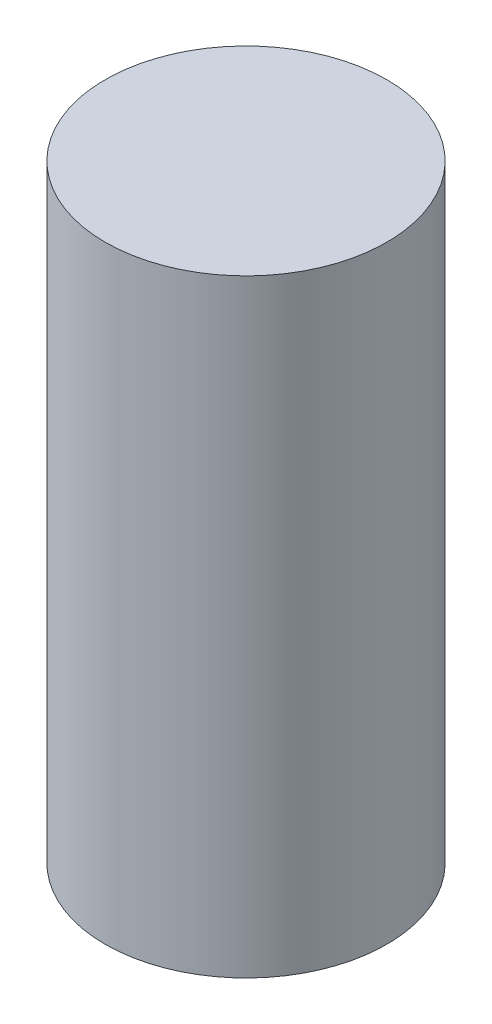
ISO-10303-21;
HEADER;
FILE_DESCRIPTION(('STEP AP214'),'2;1');
FILE_NAME('part.step','',(''),(''),'','','');
FILE_SCHEMA(('AUTOMOTIVE_DESIGN { 1 0 10303 214 1 1 1 1 }'));
ENDSEC;
DATA;
#1=APPLICATION_CONTEXT('core data for automotive mechanical design processes');
#2=APPLICATION_PROTOCOL_DEFINITION('international standard','automotive_design',2000,#1);
#3=PRODUCT_CONTEXT('',#1,'mechanical');
#4=PRODUCT('Part','Part','',(#3));
#5=PRODUCT_RELATED_PRODUCT_CATEGORY('part','',(#4));
#6=PRODUCT_DEFINITION_FORMATION('','',#4);
#7=PRODUCT_DEFINITION_CONTEXT('part definition',#1,'design');
#8=PRODUCT_DEFINITION('design','',#6,#7);
#9=PRODUCT_DEFINITION_SHAPE('','',#8);
#10=(LENGTH_UNIT() NAMED_UNIT(*) SI_UNIT(.MILLI.,.METRE.));
#11=(NAMED_UNIT(*) PLANE_ANGLE_UNIT() SI_UNIT($,.RADIAN.));
#12=(NAMED_UNIT(*) SI_UNIT($,.STERADIAN.) SOLID_ANGLE_UNIT());
#13=UNCERTAINTY_MEASURE_WITH_UNIT(LENGTH_MEASURE(1.E-05),#10,'distance_accuracy_value','');
#14=(GEOMETRIC_REPRESENTATION_CONTEXT(3) GLOBAL_UNCERTAINTY_ASSIGNED_CONTEXT((#13)) GLOBAL_UNIT_ASSIGNED_CONTEXT((#10,
#11,#12)) REPRESENTATION_CONTEXT('',''));
#15=CARTESIAN_POINT('',(0.,0.,0.));
#16=DIRECTION('',(0.,0.,1.));
#17=DIRECTION('',(1.,0.,0.));
#18=AXIS2_PLACEMENT_3D('',#15,#16,#17);
#19=CARTESIAN_POINT('',(0.,190.,0.));
#20=DIRECTION('',(0.,-1.,0.));
#21=DIRECTION('',(0.,0.,-1.));
#22=AXIS2_PLACEMENT_3D('',#19,#20,#21);
#23=CYLINDRICAL_SURFACE('',#22,44.);
#24=CARTESIAN_POINT('',(0.,190.,0.));
#25=DIRECTION('',(0.,1.,0.));
#26=DIRECTION('',(0.,0.,1.));
#27=AXIS2_PLACEMENT_3D('',#24,#25,#26);
#28=CIRCLE('',#27,44.);
#29=CARTESIAN_POINT('',(0.,190.,44.));
#30=VERTEX_POINT('',#29);
#31=EDGE_CURVE('E10',#30,#30,#28,.T.);
#32=ORIENTED_EDGE('',*,*,#31,.F.);
#33=EDGE_LOOP('',(#32));
#34=FACE_BOUND('',#33,.T.);
#35=CARTESIAN_POINT('',(0.,0.,0.));
#36=DIRECTION('',(0.,1.,0.));
#37=DIRECTION('',(0.,0.,1.));
#38=AXIS2_PLACEMENT_3D('',#35,#36,#37);
#39=CIRCLE('',#38,44.);
#40=CARTESIAN_POINT('',(0.,0.,44.));
#41=VERTEX_POINT('',#40);
#42=EDGE_CURVE('E40',#41,#41,#39,.T.);
#43=ORIENTED_EDGE('',*,*,#42,.T.);
#44=EDGE_LOOP('',(#43));
#45=FACE_BOUND('',#44,.T.);
#46=ADVANCED_FACE('F37',(#34,#45),#23,.T.);
#47=CARTESIAN_POINT('',(0.,190.,0.));
#48=DIRECTION('',(0.,1.,0.));
#49=DIRECTION('',(0.,0.,1.));
#50=AXIS2_PLACEMENT_3D('',#47,#48,#49);
#51=PLANE('',#50);
#52=ORIENTED_EDGE('',*,*,#31,.T.);
#53=EDGE_LOOP('',(#52));
#54=FACE_BOUND('',#53,.T.);
#55=ADVANCED_FACE('F52',(#54),#51,.T.);
#56=CARTESIAN_POINT('',(0.,0.,0.));
#57=DIRECTION('',(0.,1.,0.));
#58=DIRECTION('',(0.,0.,1.));
#59=AXIS2_PLACEMENT_3D('',#56,#57,#58);
#60=PLANE('',#59);
#61=ORIENTED_EDGE('',*,*,#42,.F.);
#62=EDGE_LOOP('',(#61));
#63=FACE_BOUND('',#62,.T.);
#64=ADVANCED_FACE('F50',(#63),#60,.F.);
#65=CLOSED_SHELL('',(#46,#55,#64));
#66=MANIFOLD_SOLID_BREP('B2',#65);
#67=ADVANCED_BREP_SHAPE_REPRESENTATION('',(#18,#66),#14);
#68=SHAPE_DEFINITION_REPRESENTATION(#9,#67);
ENDSEC;
END-ISO-10303-21;
